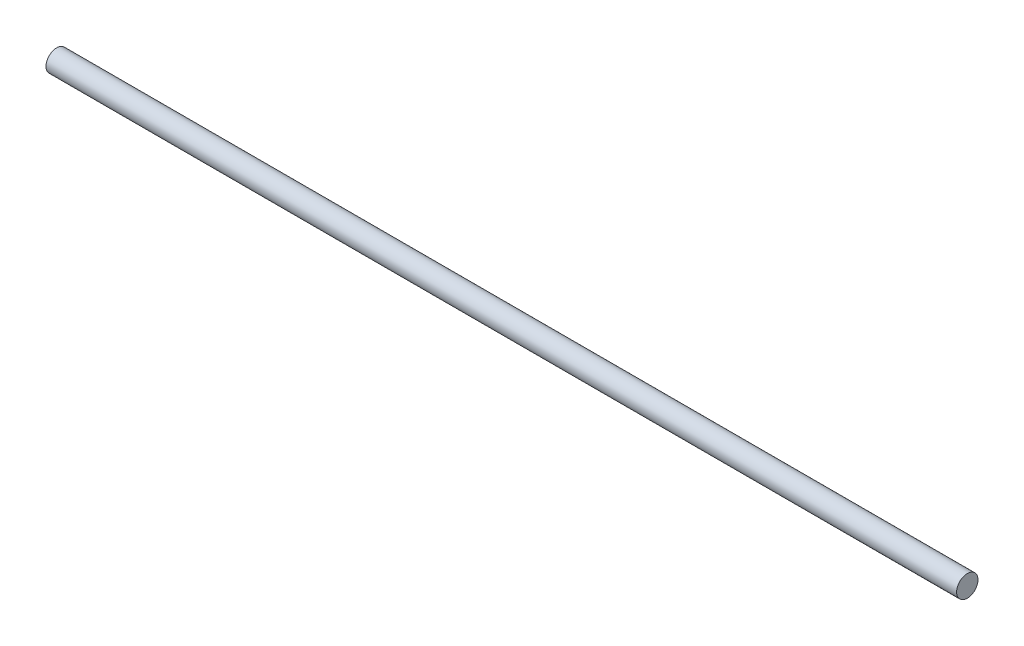
ISO-10303-21;
HEADER;
FILE_DESCRIPTION(('STEP AP214'),'2;1');
FILE_NAME('part.step','',(''),(''),'','','');
FILE_SCHEMA(('AUTOMOTIVE_DESIGN { 1 0 10303 214 1 1 1 1 }'));
ENDSEC;
DATA;
#1=APPLICATION_CONTEXT('core data for automotive mechanical design processes');
#2=APPLICATION_PROTOCOL_DEFINITION('international standard','automotive_design',2000,#1);
#3=PRODUCT_CONTEXT('',#1,'mechanical');
#4=PRODUCT('Part','Part','',(#3));
#5=PRODUCT_RELATED_PRODUCT_CATEGORY('part','',(#4));
#6=PRODUCT_DEFINITION_FORMATION('','',#4);
#7=PRODUCT_DEFINITION_CONTEXT('part definition',#1,'design');
#8=PRODUCT_DEFINITION('design','',#6,#7);
#9=PRODUCT_DEFINITION_SHAPE('','',#8);
#10=(LENGTH_UNIT() NAMED_UNIT(*) SI_UNIT(.MILLI.,.METRE.));
#11=(NAMED_UNIT(*) PLANE_ANGLE_UNIT() SI_UNIT($,.RADIAN.));
#12=(NAMED_UNIT(*) SI_UNIT($,.STERADIAN.) SOLID_ANGLE_UNIT());
#13=UNCERTAINTY_MEASURE_WITH_UNIT(LENGTH_MEASURE(1.E-05),#10,'distance_accuracy_value','');
#14=(GEOMETRIC_REPRESENTATION_CONTEXT(3) GLOBAL_UNCERTAINTY_ASSIGNED_CONTEXT((#13)) GLOBAL_UNIT_ASSIGNED_CONTEXT((#10,
#11,#12)) REPRESENTATION_CONTEXT('',''));
#15=CARTESIAN_POINT('',(0.,0.,0.));
#16=DIRECTION('',(0.,0.,1.));
#17=DIRECTION('',(1.,0.,0.));
#18=AXIS2_PLACEMENT_3D('',#15,#16,#17);
#19=CARTESIAN_POINT('',(340.,0.,0.));
#20=DIRECTION('',(-1.,0.,0.));
#21=DIRECTION('',(0.,0.,1.));
#22=AXIS2_PLACEMENT_3D('',#19,#20,#21);
#23=CYLINDRICAL_SURFACE('',#22,4.);
#24=CARTESIAN_POINT('',(340.,0.,0.));
#25=DIRECTION('',(1.,0.,0.));
#26=DIRECTION('',(0.,0.,-1.));
#27=AXIS2_PLACEMENT_3D('',#24,#25,#26);
#28=CIRCLE('',#27,4.);
#29=CARTESIAN_POINT('',(340.,0.,-4.));
#30=VERTEX_POINT('',#29);
#31=EDGE_CURVE('E10',#30,#30,#28,.T.);
#32=ORIENTED_EDGE('',*,*,#31,.F.);
#33=EDGE_LOOP('',(#32));
#34=FACE_BOUND('',#33,.T.);
#35=CARTESIAN_POINT('',(0.,0.,0.));
#36=DIRECTION('',(1.,0.,0.));
#37=DIRECTION('',(0.,0.,-1.));
#38=AXIS2_PLACEMENT_3D('',#35,#36,#37);
#39=CIRCLE('',#38,4.);
#40=CARTESIAN_POINT('',(0.,0.,-4.));
#41=VERTEX_POINT('',#40);
#42=EDGE_CURVE('E38',#41,#41,#39,.T.);
#43=ORIENTED_EDGE('',*,*,#42,.T.);
#44=EDGE_LOOP('',(#43));
#45=FACE_BOUND('',#44,.T.);
#46=ADVANCED_FACE('F35',(#34,#45),#23,.T.);
#47=CARTESIAN_POINT('',(340.,0.,0.));
#48=DIRECTION('',(1.,0.,0.));
#49=DIRECTION('',(0.,0.,-1.));
#50=AXIS2_PLACEMENT_3D('',#47,#48,#49);
#51=PLANE('',#50);
#52=ORIENTED_EDGE('',*,*,#31,.T.);
#53=EDGE_LOOP('',(#52));
#54=FACE_BOUND('',#53,.T.);
#55=ADVANCED_FACE('F50',(#54),#51,.T.);
#56=CARTESIAN_POINT('',(0.,0.,0.));
#57=DIRECTION('',(1.,0.,0.));
#58=DIRECTION('',(0.,0.,-1.));
#59=AXIS2_PLACEMENT_3D('',#56,#57,#58);
#60=PLANE('',#59);
#61=ORIENTED_EDGE('',*,*,#42,.F.);
#62=EDGE_LOOP('',(#61));
#63=FACE_BOUND('',#62,.T.);
#64=ADVANCED_FACE('F48',(#63),#60,.F.);
#65=CLOSED_SHELL('',(#46,#55,#64));
#66=MANIFOLD_SOLID_BREP('B2',#65);
#67=ADVANCED_BREP_SHAPE_REPRESENTATION('',(#18,#66),#14);
#68=SHAPE_DEFINITION_REPRESENTATION(#9,#67);
ENDSEC;
END-ISO-10303-21;
